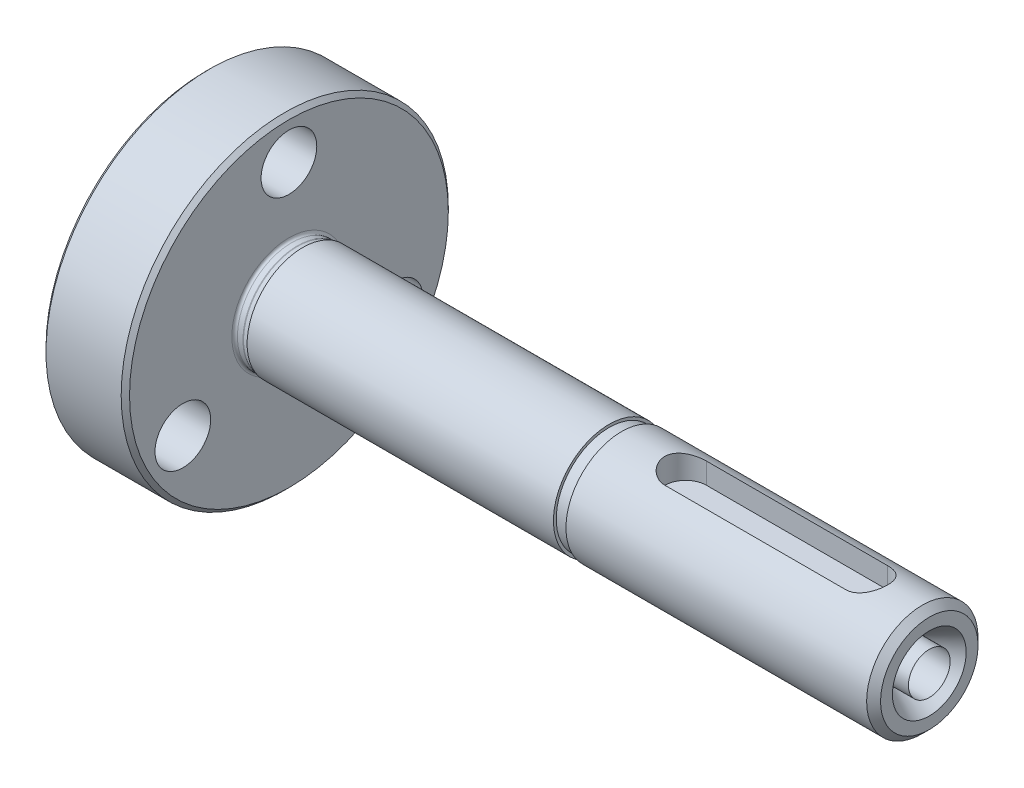
ISO-10303-21;
HEADER;
FILE_DESCRIPTION(('STEP AP214'),'2;1');
FILE_NAME('part.step','',(''),(''),'','','');
FILE_SCHEMA(('AUTOMOTIVE_DESIGN { 1 0 10303 214 1 1 1 1 }'));
ENDSEC;
DATA;
#1=APPLICATION_CONTEXT('core data for automotive mechanical design processes');
#2=APPLICATION_PROTOCOL_DEFINITION('international standard','automotive_design',2000,#1);
#3=PRODUCT_CONTEXT('',#1,'mechanical');
#4=PRODUCT('Part','Part','',(#3));
#5=PRODUCT_RELATED_PRODUCT_CATEGORY('part','',(#4));
#6=PRODUCT_DEFINITION_FORMATION('','',#4);
#7=PRODUCT_DEFINITION_CONTEXT('part definition',#1,'design');
#8=PRODUCT_DEFINITION('design','',#6,#7);
#9=PRODUCT_DEFINITION_SHAPE('','',#8);
#10=(LENGTH_UNIT() NAMED_UNIT(*) SI_UNIT(.MILLI.,.METRE.));
#11=(NAMED_UNIT(*) PLANE_ANGLE_UNIT() SI_UNIT($,.RADIAN.));
#12=(NAMED_UNIT(*) SI_UNIT($,.STERADIAN.) SOLID_ANGLE_UNIT());
#13=UNCERTAINTY_MEASURE_WITH_UNIT(LENGTH_MEASURE(1.E-05),#10,'distance_accuracy_value','');
#14=(GEOMETRIC_REPRESENTATION_CONTEXT(3) GLOBAL_UNCERTAINTY_ASSIGNED_CONTEXT((#13)) GLOBAL_UNIT_ASSIGNED_CONTEXT((#10,
#11,#12)) REPRESENTATION_CONTEXT('',''));
#15=CARTESIAN_POINT('',(0.,0.,0.));
#16=DIRECTION('',(0.,0.,1.));
#17=DIRECTION('',(1.,0.,0.));
#18=AXIS2_PLACEMENT_3D('',#15,#16,#17);
#19=CARTESIAN_POINT('',(33.9999999999918,0.,0.));
#20=DIRECTION('',(1.,0.,0.));
#21=DIRECTION('',(0.,0.,-1.));
#22=AXIS2_PLACEMENT_3D('',#19,#20,#21);
#23=CONICAL_SURFACE('',#22,1.2499999999136,1.02974425857496);
#24=CARTESIAN_POINT('',(33.2489242261431,0.,8.5265128291212E-11));
#25=VERTEX_POINT('',#24);
#26=VERTEX_LOOP('',#25);
#27=FACE_BOUND('',#26,.T.);
#28=CARTESIAN_POINT('',(34.,0.,0.));
#29=DIRECTION('',(1.,0.,0.));
#30=DIRECTION('',(0.,0.,-1.));
#31=AXIS2_PLACEMENT_3D('',#28,#29,#30);
#32=CIRCLE('',#31,1.25);
#33=CARTESIAN_POINT('',(34.,0.,-1.25));
#34=VERTEX_POINT('',#33);
#35=EDGE_CURVE('P0_E74',#34,#34,#32,.T.);
#36=ORIENTED_EDGE('',*,*,#35,.T.);
#37=EDGE_LOOP('',(#36));
#38=FACE_BOUND('',#37,.T.);
#39=ADVANCED_FACE('P0_F17',(#27,#38),#23,.F.);
#40=CARTESIAN_POINT('',(32.61137043753,0.,0.));
#41=DIRECTION('',(1.,0.,0.));
#42=DIRECTION('',(0.,0.,-1.));
#43=AXIS2_PLACEMENT_3D('',#40,#41,#42);
#44=CYLINDRICAL_SURFACE('',#43,1.25);
#45=ORIENTED_EDGE('',*,*,#35,.F.);
#46=EDGE_LOOP('',(#45));
#47=FACE_BOUND('',#46,.T.);
#48=CARTESIAN_POINT('',(43.1896987833511,0.,0.));
#49=DIRECTION('',(1.,0.,0.));
#50=DIRECTION('',(0.,0.,-1.));
#51=AXIS2_PLACEMENT_3D('',#48,#49,#50);
#52=CIRCLE('',#51,1.24999999997044);
#53=CARTESIAN_POINT('',(43.1896987833511,0.,-1.24999999997044));
#54=VERTEX_POINT('',#53);
#55=EDGE_CURVE('P0_E76',#54,#54,#52,.T.);
#56=ORIENTED_EDGE('',*,*,#55,.T.);
#57=EDGE_LOOP('',(#56));
#58=FACE_BOUND('',#57,.T.);
#59=ADVANCED_FACE('P0_F70',(#47,#58),#44,.F.);
#60=CARTESIAN_POINT('',(43.3999999999628,0.,0.));
#61=DIRECTION('',(1.,0.,0.));
#62=DIRECTION('',(0.,0.,-1.));
#63=AXIS2_PLACEMENT_3D('',#60,#61,#62);
#64=CONICAL_SURFACE('',#63,1.59999999993943,1.02974425871463);
#65=ORIENTED_EDGE('',*,*,#55,.F.);
#66=EDGE_LOOP('',(#65));
#67=FACE_BOUND('',#66,.T.);
#68=CARTESIAN_POINT('',(43.4,0.,0.));
#69=DIRECTION('',(1.,0.,0.));
#70=DIRECTION('',(0.,0.,-1.));
#71=AXIS2_PLACEMENT_3D('',#68,#69,#70);
#72=CIRCLE('',#71,1.6);
#73=CARTESIAN_POINT('',(43.4,0.,-1.6));
#74=VERTEX_POINT('',#73);
#75=EDGE_CURVE('P0_E79',#74,#74,#72,.T.);
#76=ORIENTED_EDGE('',*,*,#75,.T.);
#77=EDGE_LOOP('',(#76));
#78=FACE_BOUND('',#77,.T.);
#79=ADVANCED_FACE('P0_F324',(#67,#78),#64,.F.);
#80=CARTESIAN_POINT('',(42.26055416003,0.,0.));
#81=DIRECTION('',(1.,0.,0.));
#82=DIRECTION('',(0.,0.,-1.));
#83=AXIS2_PLACEMENT_3D('',#80,#81,#82);
#84=CYLINDRICAL_SURFACE('',#83,1.6);
#85=ORIENTED_EDGE('',*,*,#75,.F.);
#86=EDGE_LOOP('',(#85));
#87=FACE_BOUND('',#86,.T.);
#88=CARTESIAN_POINT('',(44.1813466520102,0.,0.));
#89=DIRECTION('',(1.,0.,0.));
#90=DIRECTION('',(0.,0.,-1.));
#91=AXIS2_PLACEMENT_3D('',#88,#89,#90);
#92=CIRCLE('',#91,1.59999999999627);
#93=CARTESIAN_POINT('',(44.1813466520102,0.,-1.59999999999627));
#94=VERTEX_POINT('',#93);
#95=EDGE_CURVE('P0_E391',#94,#94,#92,.T.);
#96=ORIENTED_EDGE('',*,*,#95,.T.);
#97=EDGE_LOOP('',(#96));
#98=FACE_BOUND('',#97,.T.);
#99=ADVANCED_FACE('P0_F314',(#87,#98),#84,.F.);
#100=CARTESIAN_POINT('',(45.9999999999923,0.,0.));
#101=DIRECTION('',(1.,0.,0.));
#102=DIRECTION('',(0.,0.,-1.));
#103=AXIS2_PLACEMENT_3D('',#100,#101,#102);
#104=CONICAL_SURFACE('',#103,2.65000000001692,0.523598775598548);
#105=ORIENTED_EDGE('',*,*,#95,.F.);
#106=EDGE_LOOP('',(#105));
#107=FACE_BOUND('',#106,.T.);
#108=CARTESIAN_POINT('',(45.9999999999923,0.,0.));
#109=DIRECTION('',(1.,0.,0.));
#110=DIRECTION('',(0.,0.,-1.));
#111=AXIS2_PLACEMENT_3D('',#108,#109,#110);
#112=CIRCLE('',#111,2.65000000001692);
#113=CARTESIAN_POINT('',(45.9999999999923,0.,-2.65000000001692));
#114=VERTEX_POINT('',#113);
#115=EDGE_CURVE('P0_E21',#114,#114,#112,.F.);
#116=ORIENTED_EDGE('',*,*,#115,.F.);
#117=EDGE_LOOP('',(#116));
#118=FACE_BOUND('',#117,.T.);
#119=ADVANCED_FACE('P0_F304',(#107,#118),#104,.F.);
#120=CARTESIAN_POINT('',(0.,2.2,0.));
#121=DIRECTION('',(0.,1.,0.));
#122=DIRECTION('',(0.,0.,1.));
#123=AXIS2_PLACEMENT_3D('',#120,#121,#122);
#124=PLANE('',#123);
#125=DIRECTION('',(1.,0.,0.));
#126=VECTOR('',#125,1.);
#127=CARTESIAN_POINT('',(28.5,2.2,1.5));
#128=LINE('',#127,#126);
#129=CARTESIAN_POINT('',(28.5,2.2,1.5));
#130=VERTEX_POINT('',#129);
#131=CARTESIAN_POINT('',(41.5,2.2,1.5));
#132=VERTEX_POINT('',#131);
#133=EDGE_CURVE('P0_E65',#130,#132,#128,.T.);
#134=ORIENTED_EDGE('',*,*,#133,.T.);
#135=CARTESIAN_POINT('',(41.5,2.2,0.));
#136=DIRECTION('',(0.,1.,0.));
#137=DIRECTION('',(0.,0.,1.));
#138=AXIS2_PLACEMENT_3D('',#135,#136,#137);
#139=CIRCLE('',#138,1.5);
#140=CARTESIAN_POINT('',(41.5,2.2,-1.5));
#141=VERTEX_POINT('',#140);
#142=EDGE_CURVE('P0_E380',#132,#141,#139,.T.);
#143=ORIENTED_EDGE('',*,*,#142,.T.);
#144=DIRECTION('',(-1.,0.,0.));
#145=VECTOR('',#144,1.);
#146=CARTESIAN_POINT('',(41.5,2.2,-1.5));
#147=LINE('',#146,#145);
#148=CARTESIAN_POINT('',(28.5,2.2,-1.5));
#149=VERTEX_POINT('',#148);
#150=EDGE_CURVE('P0_E383',#141,#149,#147,.T.);
#151=ORIENTED_EDGE('',*,*,#150,.T.);
#152=CARTESIAN_POINT('',(28.5,2.2,0.));
#153=DIRECTION('',(0.,1.,0.));
#154=DIRECTION('',(0.,0.,1.));
#155=AXIS2_PLACEMENT_3D('',#152,#153,#154);
#156=CIRCLE('',#155,1.5);
#157=EDGE_CURVE('P0_E59',#149,#130,#156,.T.);
#158=ORIENTED_EDGE('',*,*,#157,.T.);
#159=EDGE_LOOP('',(#134,#143,#151,#158));
#160=FACE_BOUND('',#159,.T.);
#161=ADVANCED_FACE('P0_F294',(#160),#124,.T.);
#162=CARTESIAN_POINT('',(46.,0.,0.));
#163=DIRECTION('',(1.,0.,0.));
#164=DIRECTION('',(0.,0.,-1.));
#165=AXIS2_PLACEMENT_3D('',#162,#163,#164);
#166=PLANE('',#165);
#167=CARTESIAN_POINT('',(46.0000000000491,0.,0.));
#168=DIRECTION('',(-1.,0.,0.));
#169=DIRECTION('',(0.,0.,1.));
#170=AXIS2_PLACEMENT_3D('',#167,#168,#169);
#171=CIRCLE('',#170,3.49999999991724);
#172=CARTESIAN_POINT('',(46.0000000000491,0.,3.49999999991724));
#173=VERTEX_POINT('',#172);
#174=EDGE_CURVE('P0_E375',#173,#173,#171,.T.);
#175=ORIENTED_EDGE('',*,*,#174,.F.);
#176=EDGE_LOOP('',(#175));
#177=FACE_BOUND('',#176,.T.);
#178=ORIENTED_EDGE('',*,*,#115,.T.);
#179=EDGE_LOOP('',(#178));
#180=FACE_BOUND('',#179,.T.);
#181=ADVANCED_FACE('P0_F285',(#177,#180),#166,.T.);
#182=CARTESIAN_POINT('',(28.5,4.1,1.5));
#183=DIRECTION('',(0.,0.,1.));
#184=DIRECTION('',(1.,0.,0.));
#185=AXIS2_PLACEMENT_3D('',#182,#183,#184);
#186=PLANE('',#185);
#187=DIRECTION('',(0.,1.,0.));
#188=VECTOR('',#187,1.);
#189=CARTESIAN_POINT('',(28.5,4.1,1.5));
#190=LINE('',#189,#188);
#191=CARTESIAN_POINT('',(28.5,3.70809924354784,1.49999999999999));
#192=VERTEX_POINT('',#191);
#193=EDGE_CURVE('P0_E386',#130,#192,#190,.T.);
#194=ORIENTED_EDGE('',*,*,#193,.T.);
#195=DIRECTION('',(1.,0.,0.));
#196=VECTOR('',#195,1.);
#197=CARTESIAN_POINT('',(-2.09,3.70809924354784,1.49999999999998));
#198=LINE('',#197,#196);
#199=CARTESIAN_POINT('',(41.5,3.70809924354784,1.5));
#200=VERTEX_POINT('',#199);
#201=EDGE_CURVE('P0_E373',#200,#192,#198,.F.);
#202=ORIENTED_EDGE('',*,*,#201,.F.);
#203=DIRECTION('',(0.,1.,0.));
#204=VECTOR('',#203,1.);
#205=CARTESIAN_POINT('',(41.5,4.1,1.5));
#206=LINE('',#205,#204);
#207=EDGE_CURVE('P0_E381',#200,#132,#206,.F.);
#208=ORIENTED_EDGE('',*,*,#207,.T.);
#209=ORIENTED_EDGE('',*,*,#133,.F.);
#210=EDGE_LOOP('',(#194,#202,#208,#209));
#211=FACE_BOUND('',#210,.T.);
#212=ADVANCED_FACE('P0_F277',(#211),#186,.F.);
#213=CARTESIAN_POINT('',(28.5,4.1,0.));
#214=DIRECTION('',(0.,1.,0.));
#215=DIRECTION('',(0.,0.,1.));
#216=AXIS2_PLACEMENT_3D('',#213,#214,#215);
#217=CYLINDRICAL_SURFACE('',#216,1.5);
#218=DIRECTION('',(0.,1.,0.));
#219=VECTOR('',#218,1.);
#220=CARTESIAN_POINT('',(28.5,4.1,-1.5));
#221=LINE('',#220,#219);
#222=CARTESIAN_POINT('',(28.5,3.70809924354784,-1.5));
#223=VERTEX_POINT('',#222);
#224=EDGE_CURVE('P0_E384',#149,#223,#221,.T.);
#225=ORIENTED_EDGE('',*,*,#224,.T.);
#226=CARTESIAN_POINT('',(28.5,3.70809924354783,1.5));
#227=CARTESIAN_POINT('',(28.4594074669704,3.70809443619348,1.50000149729856));
#228=CARTESIAN_POINT('',(28.4188360707122,3.70876663375751,1.49835118206537));
#229=CARTESIAN_POINT('',(28.3380154612727,3.71141673218275,1.49177905295192));
#230=CARTESIAN_POINT('',(28.2977661445068,3.7133941946446,1.48685833749724));
#231=CARTESIAN_POINT('',(28.1782327842748,3.72118975606221,1.46729482367934));
#232=CARTESIAN_POINT('',(28.0998003397728,3.7288718840421,1.44784998767984));
#233=CARTESIAN_POINT('',(27.9476324814849,3.74825217997878,1.39690233043372));
#234=CARTESIAN_POINT('',(27.8738931709593,3.75994696323811,1.36540966903062));
#235=CARTESIAN_POINT('',(27.7326664799387,3.78602388200091,1.29134097725473));
#236=CARTESIAN_POINT('',(27.6651842779876,3.80040821426565,1.24875587557702));
#237=CARTESIAN_POINT('',(27.5351080800593,3.83103589828726,1.15146603872016));
#238=CARTESIAN_POINT('',(27.4728699856818,3.84733374054252,1.09630269892843));
#239=CARTESIAN_POINT('',(27.3582764069826,3.8794978206844,0.976394584974255));
#240=CARTESIAN_POINT('',(27.3059228356596,3.8953639745168,0.9116479604297));
#241=CARTESIAN_POINT('',(27.2108597857464,3.92552893891845,0.771693719740034));
#242=CARTESIAN_POINT('',(27.1685393993163,3.93975598379754,0.696204968758626));
#243=CARTESIAN_POINT('',(27.0973480889171,3.96438035322528,0.538553622304922));
#244=CARTESIAN_POINT('',(27.0684721505131,3.97477910532575,0.456393528521803));
#245=CARTESIAN_POINT('',(27.0262422811784,3.99018690464435,0.291490050670585));
#246=CARTESIAN_POINT('',(27.0122726156961,3.99540906103972,0.208924649211906));
#247=CARTESIAN_POINT('',(26.998278802068,4.00064014015322,0.0424658385808838));
#248=CARTESIAN_POINT('',(26.9982503631981,4.00065066686691,-0.0414271540462145));
#249=CARTESIAN_POINT('',(27.011781806229,3.99559264174045,-0.203744100069412));
#250=CARTESIAN_POINT('',(27.0246694752074,3.99077535168083,-0.282233282883087));
#251=CARTESIAN_POINT('',(27.0625362711122,3.97693262269583,-0.435840275995118));
#252=CARTESIAN_POINT('',(27.0875160846463,3.96790694481372,-0.510957894586933));
#253=CARTESIAN_POINT('',(27.1491703925958,3.94637770601049,-0.65698891719658));
#254=CARTESIAN_POINT('',(27.1860098409234,3.93382542785069,-0.727825198012181));
#255=CARTESIAN_POINT('',(27.2701920375731,3.90651314175191,-0.862486444375067));
#256=CARTESIAN_POINT('',(27.3175382017873,3.89175241632298,-0.926309119580091));
#257=CARTESIAN_POINT('',(27.4246231314911,3.86052643048223,-1.04908600084313));
#258=CARTESIAN_POINT('',(27.484924384335,3.84401196825707,-1.10753779261244));
#259=CARTESIAN_POINT('',(27.6145841343778,3.81182684214318,-1.21369725159035));
#260=CARTESIAN_POINT('',(27.6839461746474,3.79615651174147,-1.26140069584828));
#261=CARTESIAN_POINT('',(27.8317580284138,3.7671186794103,-1.34567998313248));
#262=CARTESIAN_POINT('',(27.9103784056676,3.75381153298453,-1.38197861969246));
#263=CARTESIAN_POINT('',(28.0732063218419,3.73171449181344,-1.44059114536973));
#264=CARTESIAN_POINT('',(28.157404204933,3.72291700934124,-1.46292853893353));
#265=CARTESIAN_POINT('',(28.2853810176478,3.7140622685257,-1.48519272209728));
#266=CARTESIAN_POINT('',(28.3281023295206,3.71183476402566,-1.49074028414002));
#267=CARTESIAN_POINT('',(28.4138740688717,3.70885093143242,-1.49814308997677));
#268=CARTESIAN_POINT('',(28.4569241530294,3.70809323601798,-1.50000176547338));
#269=CARTESIAN_POINT('',(28.5,3.70809924354783,-1.5));
#270=B_SPLINE_CURVE_WITH_KNOTS('',3,(#226,#227,#228,#229,#230,#231,#232,#233,#234,#235,#236,
#237,#238,#239,#240,#241,#242,#243,#244,#245,#246,#247,#248,#249,#250,#251,#252,#253,#254,#255,
#256,#257,#258,#259,#260,#261,#262,#263,#264,#265,#266,#267,#268,#269),.UNSPECIFIED.,.F.,.F.,(4,
2,2,2,2,2,2,2,2,2,2,2,2,2,2,2,2,2,2,2,2,4),(0.,0.121697465666182,0.243354077586416,
0.485593064591345,0.727628221922012,0.969861938431282,1.22298027419406,1.47614754705134,
1.73793539440997,1.9996255232324,2.25002925199203,2.50035591335681,2.73829765644058,
2.97625291175452,3.21767225141682,3.45917019544674,3.7147799395163,3.97048993642582,
4.23200510445915,4.49307880432491,4.62233004062784,4.75146098044213),.UNSPECIFIED.);
#271=EDGE_CURVE('P0_E130',#192,#223,#270,.T.);
#272=ORIENTED_EDGE('',*,*,#271,.F.);
#273=ORIENTED_EDGE('',*,*,#193,.F.);
#274=ORIENTED_EDGE('',*,*,#157,.F.);
#275=EDGE_LOOP('',(#225,#272,#273,#274));
#276=FACE_BOUND('',#275,.T.);
#277=ADVANCED_FACE('P0_F268',(#276),#217,.F.);
#278=CARTESIAN_POINT('',(41.5,4.1,-1.5));
#279=DIRECTION('',(0.,0.,-1.));
#280=DIRECTION('',(-1.,0.,0.));
#281=AXIS2_PLACEMENT_3D('',#278,#279,#280);
#282=PLANE('',#281);
#283=DIRECTION('',(0.,1.,0.));
#284=VECTOR('',#283,1.);
#285=CARTESIAN_POINT('',(41.5,4.1,-1.5));
#286=LINE('',#285,#284);
#287=CARTESIAN_POINT('',(41.5,3.70809924354784,-1.49999999999999));
#288=VERTEX_POINT('',#287);
#289=EDGE_CURVE('P0_E378',#141,#288,#286,.T.);
#290=ORIENTED_EDGE('',*,*,#289,.T.);
#291=DIRECTION('',(1.,0.,0.));
#292=VECTOR('',#291,1.);
#293=CARTESIAN_POINT('',(-2.09,3.70809924354784,-1.49999999999998));
#294=LINE('',#293,#292);
#295=EDGE_CURVE('P0_E36',#223,#288,#294,.T.);
#296=ORIENTED_EDGE('',*,*,#295,.F.);
#297=ORIENTED_EDGE('',*,*,#224,.F.);
#298=ORIENTED_EDGE('',*,*,#150,.F.);
#299=EDGE_LOOP('',(#290,#296,#297,#298));
#300=FACE_BOUND('',#299,.T.);
#301=ADVANCED_FACE('P0_F155',(#300),#282,.F.);
#302=CARTESIAN_POINT('',(41.5,4.1,0.));
#303=DIRECTION('',(0.,1.,0.));
#304=DIRECTION('',(0.,0.,1.));
#305=AXIS2_PLACEMENT_3D('',#302,#303,#304);
#306=CYLINDRICAL_SURFACE('',#305,1.5);
#307=ORIENTED_EDGE('',*,*,#142,.F.);
#308=ORIENTED_EDGE('',*,*,#207,.F.);
#309=CARTESIAN_POINT('',(41.5,3.70809924354783,-1.5));
#310=CARTESIAN_POINT('',(41.5405925330296,3.70809443619348,-1.50000149729856));
#311=CARTESIAN_POINT('',(41.5811639292878,3.70876663375751,-1.49835118206537));
#312=CARTESIAN_POINT('',(41.6619845387273,3.71141673218275,-1.49177905295192));
#313=CARTESIAN_POINT('',(41.7022338554932,3.7133941946446,-1.48685833749724));
#314=CARTESIAN_POINT('',(41.8217672157252,3.72118975606221,-1.46729482367935));
#315=CARTESIAN_POINT('',(41.9001996602272,3.72887188404209,-1.44784998767984));
#316=CARTESIAN_POINT('',(42.0523675185151,3.74825217997878,-1.39690233043372));
#317=CARTESIAN_POINT('',(42.1261068290407,3.7599469632381,-1.36540966903062));
#318=CARTESIAN_POINT('',(42.2673335200613,3.7860238820009,-1.29134097725474));
#319=CARTESIAN_POINT('',(42.3348157220124,3.80040821426565,-1.24875587557702));
#320=CARTESIAN_POINT('',(42.4648919199407,3.83103589828726,-1.15146603872017));
#321=CARTESIAN_POINT('',(42.5271300143182,3.84733374054252,-1.09630269892843));
#322=CARTESIAN_POINT('',(42.6417235930174,3.8794978206844,-0.976394584974257));
#323=CARTESIAN_POINT('',(42.6940771643404,3.8953639745168,-0.911647960429702));
#324=CARTESIAN_POINT('',(42.7891402142536,3.92552893891845,-0.771693719740038));
#325=CARTESIAN_POINT('',(42.8314606006837,3.93975598379754,-0.69620496875863));
#326=CARTESIAN_POINT('',(42.9026519110829,3.96438035322528,-0.538553622304926));
#327=CARTESIAN_POINT('',(42.9315278494869,3.97477910532575,-0.456393528521808));
#328=CARTESIAN_POINT('',(42.9737577188216,3.99018690464435,-0.291490050670591));
#329=CARTESIAN_POINT('',(42.987727384304,3.99540906103972,-0.208924649211912));
#330=CARTESIAN_POINT('',(43.001721197932,4.00064014015322,-0.04246583858089));
#331=CARTESIAN_POINT('',(43.0017496368019,4.00065066686691,0.0414271540462084));
#332=CARTESIAN_POINT('',(42.988218193771,3.99559264174046,0.203744100069405));
#333=CARTESIAN_POINT('',(42.9753305247926,3.99077535168083,0.28223328288308));
#334=CARTESIAN_POINT('',(42.9374637288878,3.97693262269583,0.435840275995113));
#335=CARTESIAN_POINT('',(42.9124839153537,3.96790694481372,0.510957894586929));
#336=CARTESIAN_POINT('',(42.8508296074042,3.94637770601049,0.656988917196576));
#337=CARTESIAN_POINT('',(42.8139901590766,3.93382542785069,0.727825198012178));
#338=CARTESIAN_POINT('',(42.7298079624269,3.90651314175191,0.862486444375064));
#339=CARTESIAN_POINT('',(42.6824617982127,3.89175241632298,0.926309119580087));
#340=CARTESIAN_POINT('',(42.5753768685089,3.86052643048223,1.04908600084313));
#341=CARTESIAN_POINT('',(42.515075615665,3.84401196825707,1.10753779261244));
#342=CARTESIAN_POINT('',(42.3854158656222,3.81182684214318,1.21369725159035));
#343=CARTESIAN_POINT('',(42.3160538253526,3.79615651174147,1.26140069584828));
#344=CARTESIAN_POINT('',(42.1682419715862,3.7671186794103,1.34567998313248));
#345=CARTESIAN_POINT('',(42.0896215943324,3.75381153298453,1.38197861969245));
#346=CARTESIAN_POINT('',(41.9267936781581,3.73171449181344,1.44059114536973));
#347=CARTESIAN_POINT('',(41.842595795067,3.72291700934124,1.46292853893353));
#348=CARTESIAN_POINT('',(41.7146189823522,3.7140622685257,1.48519272209728));
#349=CARTESIAN_POINT('',(41.6718976704794,3.71183476402566,1.49074028414002));
#350=CARTESIAN_POINT('',(41.5861259311283,3.70885093143242,1.49814308997677));
#351=CARTESIAN_POINT('',(41.5430758469706,3.70809323601798,1.50000176547338));
#352=CARTESIAN_POINT('',(41.5,3.70809924354783,1.5));
#353=B_SPLINE_CURVE_WITH_KNOTS('',3,(#309,#310,#311,#312,#313,#314,#315,#316,#317,#318,#319,
#320,#321,#322,#323,#324,#325,#326,#327,#328,#329,#330,#331,#332,#333,#334,#335,#336,#337,#338,
#339,#340,#341,#342,#343,#344,#345,#346,#347,#348,#349,#350,#351,#352),.UNSPECIFIED.,.F.,.F.,(4,
2,2,2,2,2,2,2,2,2,2,2,2,2,2,2,2,2,2,2,2,4),(0.,0.121697465666185,0.243354077586416,
0.485593064591345,0.727628221922012,0.969861938431285,1.22298027419407,1.47614754705134,
1.73793539440997,1.99962552323239,2.25002925199202,2.5003559133568,2.73829765644058,
2.97625291175452,3.21767225141682,3.45917019544674,3.7147799395163,3.97048993642583,
4.23200510445914,4.49307880432491,4.62233004062784,4.75146098044214),.UNSPECIFIED.);
#354=EDGE_CURVE('P0_E123',#288,#200,#353,.T.);
#355=ORIENTED_EDGE('',*,*,#354,.F.);
#356=ORIENTED_EDGE('',*,*,#289,.F.);
#357=EDGE_LOOP('',(#307,#308,#355,#356));
#358=FACE_BOUND('',#357,.T.);
#359=ADVANCED_FACE('P0_F136',(#358),#306,.F.);
#360=CARTESIAN_POINT('',(45.4999999998904,0.,0.));
#361=DIRECTION('',(-1.,0.,0.));
#362=DIRECTION('',(0.,0.,1.));
#363=AXIS2_PLACEMENT_3D('',#360,#361,#362);
#364=CONICAL_SURFACE('',#363,4.00000000007594,0.785398163397448);
#365=CARTESIAN_POINT('',(45.5,0.,0.));
#366=DIRECTION('',(1.,0.,0.));
#367=DIRECTION('',(0.,0.,-1.));
#368=AXIS2_PLACEMENT_3D('',#365,#366,#367);
#369=CIRCLE('',#368,4.);
#370=CARTESIAN_POINT('',(45.5,0.,-4.));
#371=VERTEX_POINT('',#370);
#372=EDGE_CURVE('P0_E122',#371,#371,#369,.F.);
#373=ORIENTED_EDGE('',*,*,#372,.F.);
#374=EDGE_LOOP('',(#373));
#375=FACE_BOUND('',#374,.T.);
#376=ORIENTED_EDGE('',*,*,#174,.T.);
#377=EDGE_LOOP('',(#376));
#378=FACE_BOUND('',#377,.T.);
#379=ADVANCED_FACE('P0_F145',(#375,#378),#364,.T.);
#380=CARTESIAN_POINT('',(-2.09,0.,0.));
#381=DIRECTION('',(1.,0.,0.));
#382=DIRECTION('',(0.,0.,-1.));
#383=AXIS2_PLACEMENT_3D('',#380,#381,#382);
#384=CYLINDRICAL_SURFACE('',#383,4.);
#385=ORIENTED_EDGE('',*,*,#372,.T.);
#386=EDGE_LOOP('',(#385));
#387=FACE_BOUND('',#386,.T.);
#388=CARTESIAN_POINT('',(23.9,0.,0.));
#389=DIRECTION('',(1.,0.,0.));
#390=DIRECTION('',(0.,0.,-1.));
#391=AXIS2_PLACEMENT_3D('',#388,#389,#390);
#392=CIRCLE('',#391,4.);
#393=CARTESIAN_POINT('',(23.9,0.,-4.));
#394=VERTEX_POINT('',#393);
#395=EDGE_CURVE('P0_E119',#394,#394,#392,.T.);
#396=ORIENTED_EDGE('',*,*,#395,.T.);
#397=EDGE_LOOP('',(#396));
#398=FACE_BOUND('',#397,.T.);
#399=ORIENTED_EDGE('',*,*,#295,.T.);
#400=ORIENTED_EDGE('',*,*,#354,.T.);
#401=ORIENTED_EDGE('',*,*,#201,.T.);
#402=ORIENTED_EDGE('',*,*,#271,.T.);
#403=EDGE_LOOP('',(#399,#400,#401,#402));
#404=FACE_BOUND('',#403,.T.);
#405=ADVANCED_FACE('P0_F140',(#387,#398,#404),#384,.T.);
#406=CARTESIAN_POINT('',(23.9,0.,0.));
#407=DIRECTION('',(1.,0.,0.));
#408=DIRECTION('',(0.,0.,-1.));
#409=AXIS2_PLACEMENT_3D('',#406,#407,#408);
#410=PLANE('',#409);
#411=ORIENTED_EDGE('',*,*,#395,.F.);
#412=EDGE_LOOP('',(#411));
#413=FACE_BOUND('',#412,.T.);
#414=CARTESIAN_POINT('',(23.9,0.,0.));
#415=DIRECTION('',(1.,0.,0.));
#416=DIRECTION('',(0.,0.,-1.));
#417=AXIS2_PLACEMENT_3D('',#414,#415,#416);
#418=CIRCLE('',#417,3.8);
#419=CARTESIAN_POINT('',(23.9,0.,-3.8));
#420=VERTEX_POINT('',#419);
#421=EDGE_CURVE('P0_E116',#420,#420,#418,.F.);
#422=ORIENTED_EDGE('',*,*,#421,.F.);
#423=EDGE_LOOP('',(#422));
#424=FACE_BOUND('',#423,.T.);
#425=ADVANCED_FACE('P0_F144',(#413,#424),#410,.F.);
#426=CARTESIAN_POINT('',(-8.6,0.,0.));
#427=DIRECTION('',(1.,0.,0.));
#428=DIRECTION('',(0.,0.,-1.));
#429=AXIS2_PLACEMENT_3D('',#426,#427,#428);
#430=CYLINDRICAL_SURFACE('',#429,3.8);
#431=ORIENTED_EDGE('',*,*,#421,.T.);
#432=EDGE_LOOP('',(#431));
#433=FACE_BOUND('',#432,.T.);
#434=CARTESIAN_POINT('',(23.,0.,0.));
#435=DIRECTION('',(1.,0.,0.));
#436=DIRECTION('',(0.,0.,-1.));
#437=AXIS2_PLACEMENT_3D('',#434,#435,#436);
#438=CIRCLE('',#437,3.8);
#439=CARTESIAN_POINT('',(23.,0.,-3.8));
#440=VERTEX_POINT('',#439);
#441=EDGE_CURVE('P0_E113',#440,#440,#438,.F.);
#442=ORIENTED_EDGE('',*,*,#441,.F.);
#443=EDGE_LOOP('',(#442));
#444=FACE_BOUND('',#443,.T.);
#445=ADVANCED_FACE('P0_F223',(#433,#444),#430,.T.);
#446=CARTESIAN_POINT('',(23.,0.,0.));
#447=DIRECTION('',(1.,0.,0.));
#448=DIRECTION('',(0.,0.,-1.));
#449=AXIS2_PLACEMENT_3D('',#446,#447,#448);
#450=PLANE('',#449);
#451=CARTESIAN_POINT('',(23.,0.,0.));
#452=DIRECTION('',(1.,0.,0.));
#453=DIRECTION('',(0.,0.,-1.));
#454=AXIS2_PLACEMENT_3D('',#451,#452,#453);
#455=CIRCLE('',#454,4.);
#456=CARTESIAN_POINT('',(23.,0.,-4.));
#457=VERTEX_POINT('',#456);
#458=EDGE_CURVE('P0_E109',#457,#457,#455,.F.);
#459=ORIENTED_EDGE('',*,*,#458,.F.);
#460=EDGE_LOOP('',(#459));
#461=FACE_BOUND('',#460,.T.);
#462=ORIENTED_EDGE('',*,*,#441,.T.);
#463=EDGE_LOOP('',(#462));
#464=FACE_BOUND('',#463,.T.);
#465=ADVANCED_FACE('P0_F220',(#461,#464),#450,.T.);
#466=CARTESIAN_POINT('',(-2.09,0.,0.));
#467=DIRECTION('',(1.,0.,0.));
#468=DIRECTION('',(0.,0.,-1.));
#469=AXIS2_PLACEMENT_3D('',#466,#467,#468);
#470=CYLINDRICAL_SURFACE('',#469,4.);
#471=CARTESIAN_POINT('',(0.99679491927418,0.,0.));
#472=DIRECTION('',(1.,0.,0.));
#473=DIRECTION('',(0.,0.,-1.));
#474=AXIS2_PLACEMENT_3D('',#471,#472,#473);
#475=CIRCLE('',#474,4.00000000004752);
#476=CARTESIAN_POINT('',(0.99679491927418,0.,-4.00000000004752));
#477=VERTEX_POINT('',#476);
#478=EDGE_CURVE('P0_E112',#477,#477,#475,.F.);
#479=ORIENTED_EDGE('',*,*,#478,.F.);
#480=EDGE_LOOP('',(#479));
#481=FACE_BOUND('',#480,.T.);
#482=ORIENTED_EDGE('',*,*,#458,.T.);
#483=EDGE_LOOP('',(#482));
#484=FACE_BOUND('',#483,.T.);
#485=ADVANCED_FACE('P0_F216',(#481,#484),#470,.T.);
#486=CARTESIAN_POINT('',(0.996794919046806,0.,0.));
#487=DIRECTION('',(1.,0.,0.));
#488=DIRECTION('',(0.,0.,-1.));
#489=AXIS2_PLACEMENT_3D('',#486,#487,#488);
#490=CONICAL_SURFACE('',#489,3.99999999999068,0.261799387749815);
#491=CARTESIAN_POINT('',(0.649023147989254,0.,0.));
#492=DIRECTION('',(1.,0.,0.));
#493=DIRECTION('',(0.,0.,-1.));
#494=AXIS2_PLACEMENT_3D('',#491,#492,#493);
#495=CIRCLE('',#494,3.90681483474217);
#496=CARTESIAN_POINT('',(0.649023147989254,0.,-3.90681483474217));
#497=VERTEX_POINT('',#496);
#498=EDGE_CURVE('P0_E365',#497,#497,#495,.T.);
#499=ORIENTED_EDGE('',*,*,#498,.T.);
#500=EDGE_LOOP('',(#499));
#501=FACE_BOUND('',#500,.T.);
#502=ORIENTED_EDGE('',*,*,#478,.T.);
#503=EDGE_LOOP('',(#502));
#504=FACE_BOUND('',#503,.T.);
#505=ADVANCED_FACE('P0_F213',(#501,#504),#490,.T.);
#506=CARTESIAN_POINT('',(0.597259338968795,0.,0.));
#507=DIRECTION('',(1.,0.,0.));
#508=DIRECTION('',(0.,0.,-1.));
#509=AXIS2_PLACEMENT_3D('',#506,#507,#508);
#510=TOROIDAL_SURFACE('',#509,4.10000000000005,0.20000000000005);
#511=CARTESIAN_POINT('',(0.5972593389688,0.,0.));
#512=DIRECTION('',(1.,0.,0.));
#513=DIRECTION('',(0.,0.,-1.));
#514=AXIS2_PLACEMENT_3D('',#511,#512,#513);
#515=CIRCLE('',#514,3.9);
#516=CARTESIAN_POINT('',(0.5972593389688,0.,-3.9));
#517=VERTEX_POINT('',#516);
#518=EDGE_CURVE('P0_E362',#517,#517,#515,.F.);
#519=ORIENTED_EDGE('',*,*,#518,.F.);
#520=EDGE_LOOP('',(#519));
#521=FACE_BOUND('',#520,.T.);
#522=ORIENTED_EDGE('',*,*,#498,.F.);
#523=EDGE_LOOP('',(#522));
#524=FACE_BOUND('',#523,.T.);
#525=ADVANCED_FACE('P0_F211',(#521,#524),#510,.F.);
#526=CARTESIAN_POINT('',(-8.6,0.,0.));
#527=DIRECTION('',(1.,0.,0.));
#528=DIRECTION('',(0.,0.,-1.));
#529=AXIS2_PLACEMENT_3D('',#526,#527,#528);
#530=CYLINDRICAL_SURFACE('',#529,3.9);
#531=CARTESIAN_POINT('',(0.2,0.,0.));
#532=DIRECTION('',(1.,0.,0.));
#533=DIRECTION('',(0.,0.,-1.));
#534=AXIS2_PLACEMENT_3D('',#531,#532,#533);
#535=CIRCLE('',#534,3.9);
#536=CARTESIAN_POINT('',(0.2,0.,-3.9));
#537=VERTEX_POINT('',#536);
#538=EDGE_CURVE('P0_E108',#537,#537,#535,.T.);
#539=ORIENTED_EDGE('',*,*,#538,.T.);
#540=EDGE_LOOP('',(#539));
#541=FACE_BOUND('',#540,.T.);
#542=ORIENTED_EDGE('',*,*,#518,.T.);
#543=EDGE_LOOP('',(#542));
#544=FACE_BOUND('',#543,.T.);
#545=ADVANCED_FACE('P0_F208',(#541,#544),#530,.T.);
#546=CARTESIAN_POINT('',(0.2,0.,0.));
#547=DIRECTION('',(1.,0.,0.));
#548=DIRECTION('',(0.,0.,-1.));
#549=AXIS2_PLACEMENT_3D('',#546,#547,#548);
#550=TOROIDAL_SURFACE('',#549,4.1,0.2);
#551=CARTESIAN_POINT('',(0.,0.,0.));
#552=DIRECTION('',(1.,0.,0.));
#553=DIRECTION('',(0.,0.,-1.));
#554=AXIS2_PLACEMENT_3D('',#551,#552,#553);
#555=CIRCLE('',#554,4.1);
#556=CARTESIAN_POINT('',(0.,0.,-4.1));
#557=VERTEX_POINT('',#556);
#558=EDGE_CURVE('P0_E105',#557,#557,#555,.F.);
#559=ORIENTED_EDGE('',*,*,#558,.F.);
#560=EDGE_LOOP('',(#559));
#561=FACE_BOUND('',#560,.T.);
#562=ORIENTED_EDGE('',*,*,#538,.F.);
#563=EDGE_LOOP('',(#562));
#564=FACE_BOUND('',#563,.T.);
#565=ADVANCED_FACE('P0_F19',(#561,#564),#550,.F.);
#566=CARTESIAN_POINT('',(0.,0.,0.));
#567=DIRECTION('',(1.,0.,0.));
#568=DIRECTION('',(0.,0.,-1.));
#569=AXIS2_PLACEMENT_3D('',#566,#567,#568);
#570=PLANE('',#569);
#571=CARTESIAN_POINT('',(-9.19403442267708E-13,0.,0.));
#572=DIRECTION('',(-1.,0.,0.));
#573=DIRECTION('',(0.,0.,1.));
#574=AXIS2_PLACEMENT_3D('',#571,#572,#573);
#575=CIRCLE('',#574,11.4499999999991);
#576=CARTESIAN_POINT('',(-9.19403442267708E-13,0.,11.4499999999991));
#577=VERTEX_POINT('',#576);
#578=EDGE_CURVE('P0_E102',#577,#577,#575,.T.);
#579=ORIENTED_EDGE('',*,*,#578,.F.);
#580=EDGE_LOOP('',(#579));
#581=FACE_BOUND('',#580,.T.);
#582=ORIENTED_EDGE('',*,*,#558,.T.);
#583=EDGE_LOOP('',(#582));
#584=FACE_BOUND('',#583,.T.);
#585=CARTESIAN_POINT('',(0.,8.8,0.));
#586=DIRECTION('',(1.,0.,0.));
#587=DIRECTION('',(0.,0.,-1.));
#588=AXIS2_PLACEMENT_3D('',#585,#586,#587);
#589=CIRCLE('',#588,2.);
#590=CARTESIAN_POINT('',(0.,8.8,-2.));
#591=VERTEX_POINT('',#590);
#592=EDGE_CURVE('P0_E92',#591,#591,#589,.F.);
#593=ORIENTED_EDGE('',*,*,#592,.T.);
#594=EDGE_LOOP('',(#593));
#595=FACE_BOUND('',#594,.T.);
#596=CARTESIAN_POINT('',(0.,-4.4,7.621023553303));
#597=DIRECTION('',(1.,0.,0.));
#598=DIRECTION('',(0.,0.,-1.));
#599=AXIS2_PLACEMENT_3D('',#596,#597,#598);
#600=CIRCLE('',#599,2.);
#601=CARTESIAN_POINT('',(0.,-4.4,5.621023553303));
#602=VERTEX_POINT('',#601);
#603=EDGE_CURVE('P0_E99',#602,#602,#600,.F.);
#604=ORIENTED_EDGE('',*,*,#603,.T.);
#605=EDGE_LOOP('',(#604));
#606=FACE_BOUND('',#605,.T.);
#607=CARTESIAN_POINT('',(0.,-4.4,-7.621023553303));
#608=DIRECTION('',(1.,0.,0.));
#609=DIRECTION('',(0.,0.,-1.));
#610=AXIS2_PLACEMENT_3D('',#607,#608,#609);
#611=CIRCLE('',#610,2.);
#612=CARTESIAN_POINT('',(0.,-4.4,-9.621023553303));
#613=VERTEX_POINT('',#612);
#614=EDGE_CURVE('P0_E96',#613,#613,#611,.F.);
#615=ORIENTED_EDGE('',*,*,#614,.T.);
#616=EDGE_LOOP('',(#615));
#617=FACE_BOUND('',#616,.T.);
#618=ADVANCED_FACE('P0_F203',(#581,#584,#595,#606,#617),#570,.T.);
#619=CARTESIAN_POINT('',(-0.300000000000002,0.,0.));
#620=DIRECTION('',(-1.,0.,0.));
#621=DIRECTION('',(0.,0.,1.));
#622=AXIS2_PLACEMENT_3D('',#619,#620,#621);
#623=CONICAL_SURFACE('',#622,11.7499999999981,0.785398163397301);
#624=CARTESIAN_POINT('',(-0.3,0.,0.));
#625=DIRECTION('',(1.,0.,0.));
#626=DIRECTION('',(0.,0.,-1.));
#627=AXIS2_PLACEMENT_3D('',#624,#625,#626);
#628=CIRCLE('',#627,11.75);
#629=CARTESIAN_POINT('',(-0.3,0.,-11.75));
#630=VERTEX_POINT('',#629);
#631=EDGE_CURVE('P0_E95',#630,#630,#628,.F.);
#632=ORIENTED_EDGE('',*,*,#631,.F.);
#633=EDGE_LOOP('',(#632));
#634=FACE_BOUND('',#633,.T.);
#635=ORIENTED_EDGE('',*,*,#578,.T.);
#636=EDGE_LOOP('',(#635));
#637=FACE_BOUND('',#636,.T.);
#638=ADVANCED_FACE('P0_F199',(#634,#637),#623,.T.);
#639=CARTESIAN_POINT('',(-6.,-4.4,7.621023553303));
#640=DIRECTION('',(1.,0.,0.));
#641=DIRECTION('',(0.,0.,-1.));
#642=AXIS2_PLACEMENT_3D('',#639,#640,#641);
#643=CYLINDRICAL_SURFACE('',#642,2.);
#644=CARTESIAN_POINT('',(-5.69999999999027,-4.4,7.621023553303));
#645=DIRECTION('',(-1.,0.,0.));
#646=DIRECTION('',(0.,-1.,0.));
#647=AXIS2_PLACEMENT_3D('',#644,#645,#646);
#648=CIRCLE('',#647,1.99999999998508);
#649=CARTESIAN_POINT('',(-5.69999999999027,-6.39999999998508,7.621023553303));
#650=VERTEX_POINT('',#649);
#651=EDGE_CURVE('P0_E415',#650,#650,#648,.T.);
#652=ORIENTED_EDGE('',*,*,#651,.T.);
#653=EDGE_LOOP('',(#652));
#654=FACE_BOUND('',#653,.T.);
#655=ORIENTED_EDGE('',*,*,#603,.F.);
#656=EDGE_LOOP('',(#655));
#657=FACE_BOUND('',#656,.T.);
#658=ADVANCED_FACE('P0_F195',(#654,#657),#643,.F.);
#659=CARTESIAN_POINT('',(-6.,-4.4,-7.621023553303));
#660=DIRECTION('',(1.,0.,0.));
#661=DIRECTION('',(0.,0.,-1.));
#662=AXIS2_PLACEMENT_3D('',#659,#660,#661);
#663=CYLINDRICAL_SURFACE('',#662,2.);
#664=CARTESIAN_POINT('',(-5.69999999999027,-4.4,-7.621023553303));
#665=DIRECTION('',(-1.,0.,0.));
#666=DIRECTION('',(0.,-1.,0.));
#667=AXIS2_PLACEMENT_3D('',#664,#665,#666);
#668=CIRCLE('',#667,1.99999999998508);
#669=CARTESIAN_POINT('',(-5.69999999999027,-6.39999999998508,-7.621023553303));
#670=VERTEX_POINT('',#669);
#671=EDGE_CURVE('P0_E418',#670,#670,#668,.T.);
#672=ORIENTED_EDGE('',*,*,#671,.T.);
#673=EDGE_LOOP('',(#672));
#674=FACE_BOUND('',#673,.T.);
#675=ORIENTED_EDGE('',*,*,#614,.F.);
#676=EDGE_LOOP('',(#675));
#677=FACE_BOUND('',#676,.T.);
#678=ADVANCED_FACE('P0_F191',(#674,#677),#663,.F.);
#679=CARTESIAN_POINT('',(-6.,8.8,0.));
#680=DIRECTION('',(1.,0.,0.));
#681=DIRECTION('',(0.,0.,-1.));
#682=AXIS2_PLACEMENT_3D('',#679,#680,#681);
#683=CYLINDRICAL_SURFACE('',#682,2.);
#684=CARTESIAN_POINT('',(-5.69999999993342,8.8,0.));
#685=DIRECTION('',(-1.,0.,0.));
#686=DIRECTION('',(0.,0.,1.));
#687=AXIS2_PLACEMENT_3D('',#684,#685,#686);
#688=CIRCLE('',#687,2.00000000000955);
#689=CARTESIAN_POINT('',(-5.69999999993342,8.8,2.00000000000955));
#690=VERTEX_POINT('',#689);
#691=EDGE_CURVE('P0_E421',#690,#690,#688,.T.);
#692=ORIENTED_EDGE('',*,*,#691,.T.);
#693=EDGE_LOOP('',(#692));
#694=FACE_BOUND('',#693,.T.);
#695=ORIENTED_EDGE('',*,*,#592,.F.);
#696=EDGE_LOOP('',(#695));
#697=FACE_BOUND('',#696,.T.);
#698=ADVANCED_FACE('P0_F187',(#694,#697),#683,.F.);
#699=CARTESIAN_POINT('',(-8.6,0.,0.));
#700=DIRECTION('',(1.,0.,0.));
#701=DIRECTION('',(0.,0.,-1.));
#702=AXIS2_PLACEMENT_3D('',#699,#700,#701);
#703=CYLINDRICAL_SURFACE('',#702,11.75);
#704=ORIENTED_EDGE('',*,*,#631,.T.);
#705=EDGE_LOOP('',(#704));
#706=FACE_BOUND('',#705,.T.);
#707=CARTESIAN_POINT('',(-5.700000000001,0.,0.));
#708=DIRECTION('',(1.,0.,0.));
#709=DIRECTION('',(0.,0.,-1.));
#710=AXIS2_PLACEMENT_3D('',#707,#708,#709);
#711=CIRCLE('',#710,11.750000000001);
#712=CARTESIAN_POINT('',(-5.700000000001,0.,-11.750000000001));
#713=VERTEX_POINT('',#712);
#714=EDGE_CURVE('P0_E91',#713,#713,#711,.F.);
#715=ORIENTED_EDGE('',*,*,#714,.F.);
#716=EDGE_LOOP('',(#715));
#717=FACE_BOUND('',#716,.T.);
#718=ADVANCED_FACE('P0_F183',(#706,#717),#703,.T.);
#719=CARTESIAN_POINT('',(-5.99999999985812,-4.4,7.621023553303));
#720=DIRECTION('',(-1.,0.,0.));
#721=DIRECTION('',(0.,-1.,0.));
#722=AXIS2_PLACEMENT_3D('',#719,#720,#721);
#723=CONICAL_SURFACE('',#722,2.17320508065595,0.52359877561207);
#724=ORIENTED_EDGE('',*,*,#651,.F.);
#725=EDGE_LOOP('',(#724));
#726=FACE_BOUND('',#725,.T.);
#727=CARTESIAN_POINT('',(-6.00000000002865,-4.4,7.621023553303));
#728=DIRECTION('',(-1.,0.,0.));
#729=DIRECTION('',(0.,-1.,0.));
#730=AXIS2_PLACEMENT_3D('',#727,#728,#729);
#731=CIRCLE('',#730,2.17320508075441);
#732=CARTESIAN_POINT('',(-6.00000000002865,-6.57320508075441,7.621023553303));
#733=VERTEX_POINT('',#732);
#734=EDGE_CURVE('P0_E88',#733,#733,#731,.T.);
#735=ORIENTED_EDGE('',*,*,#734,.T.);
#736=EDGE_LOOP('',(#735));
#737=FACE_BOUND('',#736,.T.);
#738=ADVANCED_FACE('P0_F179',(#726,#737),#723,.F.);
#739=CARTESIAN_POINT('',(-5.99999999980128,-4.4,-7.621023553303));
#740=DIRECTION('',(-1.,0.,0.));
#741=DIRECTION('',(0.,-1.,0.));
#742=AXIS2_PLACEMENT_3D('',#739,#740,#741);
#743=CONICAL_SURFACE('',#742,2.1732050807128,0.523598775754177);
#744=ORIENTED_EDGE('',*,*,#671,.F.);
#745=EDGE_LOOP('',(#744));
#746=FACE_BOUND('',#745,.T.);
#747=CARTESIAN_POINT('',(-6.00000000002865,-4.4,-7.621023553303));
#748=DIRECTION('',(-1.,0.,0.));
#749=DIRECTION('',(0.,-1.,0.));
#750=AXIS2_PLACEMENT_3D('',#747,#748,#749);
#751=CIRCLE('',#750,2.17320508084407);
#752=CARTESIAN_POINT('',(-6.00000000002865,-6.57320508084407,-7.621023553303));
#753=VERTEX_POINT('',#752);
#754=EDGE_CURVE('P0_E85',#753,#753,#751,.T.);
#755=ORIENTED_EDGE('',*,*,#754,.T.);
#756=EDGE_LOOP('',(#755));
#757=FACE_BOUND('',#756,.T.);
#758=ADVANCED_FACE('P0_F175',(#746,#757),#743,.F.);
#759=CARTESIAN_POINT('',(-5.99999999980128,8.8,0.));
#760=DIRECTION('',(-1.,0.,0.));
#761=DIRECTION('',(0.,0.,1.));
#762=AXIS2_PLACEMENT_3D('',#759,#760,#761);
#763=CONICAL_SURFACE('',#762,2.17320508062357,0.523598775409899);
#764=ORIENTED_EDGE('',*,*,#691,.F.);
#765=EDGE_LOOP('',(#764));
#766=FACE_BOUND('',#765,.T.);
#767=CARTESIAN_POINT('',(-5.99999999997181,8.8,0.));
#768=DIRECTION('',(-1.,0.,0.));
#769=DIRECTION('',(0.,0.,1.));
#770=AXIS2_PLACEMENT_3D('',#767,#768,#769);
#771=CIRCLE('',#770,2.17320508072203);
#772=CARTESIAN_POINT('',(-5.99999999997181,8.8,2.17320508072203));
#773=VERTEX_POINT('',#772);
#774=EDGE_CURVE('P0_E27',#773,#773,#771,.T.);
#775=ORIENTED_EDGE('',*,*,#774,.T.);
#776=EDGE_LOOP('',(#775));
#777=FACE_BOUND('',#776,.T.);
#778=ADVANCED_FACE('P0_F167',(#766,#777),#763,.F.);
#779=CARTESIAN_POINT('',(-5.700000000001,0.,0.));
#780=DIRECTION('',(1.,0.,0.));
#781=DIRECTION('',(0.,0.,-1.));
#782=AXIS2_PLACEMENT_3D('',#779,#780,#781);
#783=CONICAL_SURFACE('',#782,11.750000000001,0.785398163397301);
#784=ORIENTED_EDGE('',*,*,#714,.T.);
#785=EDGE_LOOP('',(#784));
#786=FACE_BOUND('',#785,.T.);
#787=CARTESIAN_POINT('',(-6.00000000000104,0.,0.));
#788=DIRECTION('',(1.,0.,0.));
#789=DIRECTION('',(0.,0.,-1.));
#790=AXIS2_PLACEMENT_3D('',#787,#788,#789);
#791=CIRCLE('',#790,11.450000000001);
#792=CARTESIAN_POINT('',(-6.00000000000104,0.,-11.450000000001));
#793=VERTEX_POINT('',#792);
#794=EDGE_CURVE('P0_E11',#793,#793,#791,.T.);
#795=ORIENTED_EDGE('',*,*,#794,.T.);
#796=EDGE_LOOP('',(#795));
#797=FACE_BOUND('',#796,.T.);
#798=ADVANCED_FACE('P0_F161',(#786,#797),#783,.T.);
#799=CARTESIAN_POINT('',(-6.,0.,0.));
#800=DIRECTION('',(1.,0.,0.));
#801=DIRECTION('',(0.,0.,-1.));
#802=AXIS2_PLACEMENT_3D('',#799,#800,#801);
#803=PLANE('',#802);
#804=ORIENTED_EDGE('',*,*,#794,.F.);
#805=EDGE_LOOP('',(#804));
#806=FACE_BOUND('',#805,.T.);
#807=ORIENTED_EDGE('',*,*,#774,.F.);
#808=EDGE_LOOP('',(#807));
#809=FACE_BOUND('',#808,.T.);
#810=ORIENTED_EDGE('',*,*,#754,.F.);
#811=EDGE_LOOP('',(#810));
#812=FACE_BOUND('',#811,.T.);
#813=ORIENTED_EDGE('',*,*,#734,.F.);
#814=EDGE_LOOP('',(#813));
#815=FACE_BOUND('',#814,.T.);
#816=ADVANCED_FACE('P0_F159',(#806,#809,#812,#815),#803,.F.);
#817=CLOSED_SHELL('',(#39,#59,#79,#99,#119,#161,#181,#212,#277,#301,#359,#379,#405,#425,#445,
#465,#485,#505,#525,#545,#565,#618,#638,#658,#678,#698,#718,#738,#758,#778,#798,#816));
#818=MANIFOLD_SOLID_BREP('P0_B1',#817);
#819=CARTESIAN_POINT('',(32.61137043753,0.,0.));
#820=DIRECTION('',(1.,0.,0.));
#821=DIRECTION('',(0.,0.,-1.));
#822=AXIS2_PLACEMENT_3D('',#819,#820,#821);
#823=CYLINDRICAL_SURFACE('',#822,1.5);
#824=CARTESIAN_POINT('',(46.,0.,0.));
#825=DIRECTION('',(1.,0.,0.));
#826=DIRECTION('',(0.,0.,-1.));
#827=AXIS2_PLACEMENT_3D('',#824,#825,#826);
#828=CIRCLE('',#827,1.5);
#829=CARTESIAN_POINT('',(46.,0.,-1.5));
#830=VERTEX_POINT('',#829);
#831=EDGE_CURVE('P1_E11',#830,#830,#828,.F.);
#832=ORIENTED_EDGE('',*,*,#831,.T.);
#833=EDGE_LOOP('',(#832));
#834=FACE_BOUND('',#833,.T.);
#835=CARTESIAN_POINT('',(37.,0.,0.));
#836=DIRECTION('',(1.,0.,0.));
#837=DIRECTION('',(0.,0.,-1.));
#838=AXIS2_PLACEMENT_3D('',#835,#836,#837);
#839=CIRCLE('',#838,1.5);
#840=CARTESIAN_POINT('',(37.,0.,-1.5));
#841=VERTEX_POINT('',#840);
#842=EDGE_CURVE('P1_E21',#841,#841,#839,.T.);
#843=ORIENTED_EDGE('',*,*,#842,.T.);
#844=EDGE_LOOP('',(#843));
#845=FACE_BOUND('',#844,.T.);
#846=ADVANCED_FACE('P1_F17',(#834,#845),#823,.T.);
#847=CARTESIAN_POINT('',(37.,0.,0.));
#848=DIRECTION('',(1.,0.,0.));
#849=DIRECTION('',(0.,0.,-1.));
#850=AXIS2_PLACEMENT_3D('',#847,#848,#849);
#851=PLANE('',#850);
#852=ORIENTED_EDGE('',*,*,#842,.F.);
#853=EDGE_LOOP('',(#852));
#854=FACE_BOUND('',#853,.T.);
#855=CARTESIAN_POINT('',(37.,-1.25,0.));
#856=CARTESIAN_POINT('',(37.,-1.24979762689894,0.238457031039368));
#857=CARTESIAN_POINT('',(37.,-1.16223537632804,0.460118386952339));
#858=CARTESIAN_POINT('',(37.,-1.06748242993625,0.699982785560349));
#859=CARTESIAN_POINT('',(37.,-0.883883476483186,0.883883476483183));
#860=CARTESIAN_POINT('',(37.,-0.701725281905021,1.06634104070205));
#861=CARTESIAN_POINT('',(37.,-0.460118386952342,1.16223537632804));
#862=CARTESIAN_POINT('',(37.,-0.239488526506464,1.24980387842254));
#863=CARTESIAN_POINT('',(37.,0.,1.25));
#864=CARTESIAN_POINT('',(37.,0.237452494257286,1.25019445423304));
#865=CARTESIAN_POINT('',(37.,0.460118386952345,1.16223537632804));
#866=CARTESIAN_POINT('',(37.,0.699982799926477,1.06748241559361));
#867=CARTESIAN_POINT('',(37.,0.883883476483187,0.883883476483182));
#868=CARTESIAN_POINT('',(37.,1.06634080204046,0.701725520175108));
#869=CARTESIAN_POINT('',(37.,1.16223537632804,0.460118386952339));
#870=CARTESIAN_POINT('',(37.,1.24979673593825,0.239506853571235));
#871=CARTESIAN_POINT('',(37.,1.25,0.));
#872=B_SPLINE_CURVE_WITH_KNOTS('',2,(#855,#856,#857,#858,#859,#860,#861,#862,#863,#864,#865,
#866,#867,#868,#869,#870,#871),.UNSPECIFIED.,.F.,.F.,(3,2,2,2,2,2,2,2,3),(0.,0.125,0.25,0.375,
0.5,0.625,0.75,0.875,1.),.UNSPECIFIED.);
#873=CARTESIAN_POINT('',(37.,-1.25,0.));
#874=VERTEX_POINT('',#873);
#875=CARTESIAN_POINT('',(37.,1.25,0.));
#876=VERTEX_POINT('',#875);
#877=EDGE_CURVE('P1_E30',#874,#876,#872,.T.);
#878=ORIENTED_EDGE('',*,*,#877,.F.);
#879=CARTESIAN_POINT('',(37.,1.25,0.));
#880=CARTESIAN_POINT('',(37.,1.24979762689894,-0.238457031039368));
#881=CARTESIAN_POINT('',(37.,1.16223537632804,-0.460118386952339));
#882=CARTESIAN_POINT('',(37.,1.06748242993625,-0.699982785560349));
#883=CARTESIAN_POINT('',(37.,0.883883476483186,-0.883883476483183));
#884=CARTESIAN_POINT('',(37.,0.701725281905021,-1.06634104070205));
#885=CARTESIAN_POINT('',(37.,0.460118386952342,-1.16223537632804));
#886=CARTESIAN_POINT('',(37.,0.239488526506464,-1.24980387842254));
#887=CARTESIAN_POINT('',(37.,0.,-1.25));
#888=CARTESIAN_POINT('',(37.,-0.237452494257286,-1.25019445423304));
#889=CARTESIAN_POINT('',(37.,-0.460118386952345,-1.16223537632804));
#890=CARTESIAN_POINT('',(37.,-0.699982799926477,-1.06748241559361));
#891=CARTESIAN_POINT('',(37.,-0.883883476483187,-0.883883476483182));
#892=CARTESIAN_POINT('',(37.,-1.06634080204046,-0.701725520175108));
#893=CARTESIAN_POINT('',(37.,-1.16223537632804,-0.460118386952339));
#894=CARTESIAN_POINT('',(37.,-1.24979673593825,-0.239506853571235));
#895=CARTESIAN_POINT('',(37.,-1.25,0.));
#896=B_SPLINE_CURVE_WITH_KNOTS('',2,(#879,#880,#881,#882,#883,#884,#885,#886,#887,#888,#889,
#890,#891,#892,#893,#894,#895),.UNSPECIFIED.,.F.,.F.,(3,2,2,2,2,2,2,2,3),(0.,0.125,0.25,0.375,
0.5,0.625,0.75,0.875,1.),.UNSPECIFIED.);
#897=EDGE_CURVE('P1_E34',#876,#874,#896,.T.);
#898=ORIENTED_EDGE('',*,*,#897,.F.);
#899=EDGE_LOOP('',(#878,#898));
#900=FACE_BOUND('',#899,.T.);
#901=ADVANCED_FACE('P1_F18',(#854,#900),#851,.F.);
#902=OPEN_SHELL('',(#846,#901));
#903=SHELL_BASED_SURFACE_MODEL('P1_B1',(#902));
#904=ADVANCED_BREP_SHAPE_REPRESENTATION('',(#18,#818),#14);
#905=MANIFOLD_SURFACE_SHAPE_REPRESENTATION('',(#18,#903),#14);
#906=SHAPE_REPRESENTATION('',(#18),#14);
#907=SHAPE_DEFINITION_REPRESENTATION(#9,#906);
#908=SHAPE_REPRESENTATION_RELATIONSHIP('','',#906,#904);
#909=SHAPE_REPRESENTATION_RELATIONSHIP('','',#906,#905);
ENDSEC;
END-ISO-10303-21;
